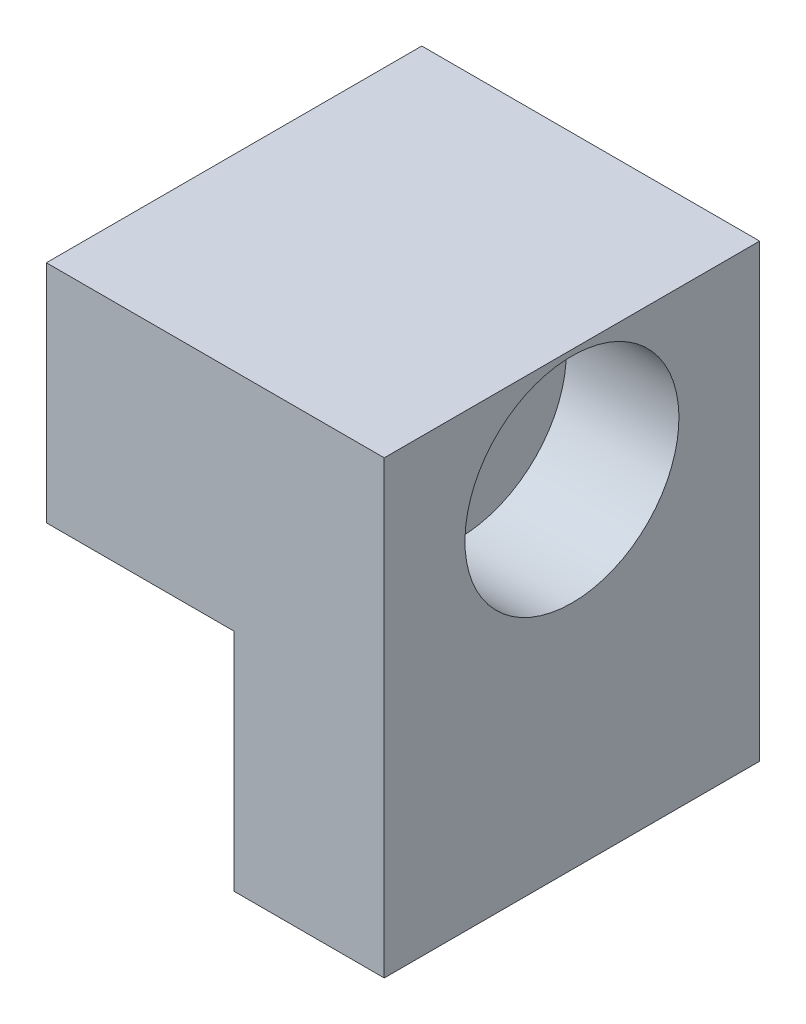
ISO-10303-21;
HEADER;
FILE_DESCRIPTION(('STEP AP214'),'2;1');
FILE_NAME('part.step','',(''),(''),'','','');
FILE_SCHEMA(('AUTOMOTIVE_DESIGN { 1 0 10303 214 1 1 1 1 }'));
ENDSEC;
DATA;
#1=APPLICATION_CONTEXT('core data for automotive mechanical design processes');
#2=APPLICATION_PROTOCOL_DEFINITION('international standard','automotive_design',2000,#1);
#3=PRODUCT_CONTEXT('',#1,'mechanical');
#4=PRODUCT('Part','Part','',(#3));
#5=PRODUCT_RELATED_PRODUCT_CATEGORY('part','',(#4));
#6=PRODUCT_DEFINITION_FORMATION('','',#4);
#7=PRODUCT_DEFINITION_CONTEXT('part definition',#1,'design');
#8=PRODUCT_DEFINITION('design','',#6,#7);
#9=PRODUCT_DEFINITION_SHAPE('','',#8);
#10=(LENGTH_UNIT() NAMED_UNIT(*) SI_UNIT(.MILLI.,.METRE.));
#11=(NAMED_UNIT(*) PLANE_ANGLE_UNIT() SI_UNIT($,.RADIAN.));
#12=(NAMED_UNIT(*) SI_UNIT($,.STERADIAN.) SOLID_ANGLE_UNIT());
#13=UNCERTAINTY_MEASURE_WITH_UNIT(LENGTH_MEASURE(1.E-05),#10,'distance_accuracy_value','');
#14=(GEOMETRIC_REPRESENTATION_CONTEXT(3) GLOBAL_UNCERTAINTY_ASSIGNED_CONTEXT((#13)) GLOBAL_UNIT_ASSIGNED_CONTEXT((#10,
#11,#12)) REPRESENTATION_CONTEXT('',''));
#15=CARTESIAN_POINT('',(0.,0.,0.));
#16=DIRECTION('',(0.,0.,1.));
#17=DIRECTION('',(1.,0.,0.));
#18=AXIS2_PLACEMENT_3D('',#15,#16,#17);
#19=CARTESIAN_POINT('',(0.,-6.,10.));
#20=DIRECTION('',(1.,0.,0.));
#21=DIRECTION('',(0.,0.,-1.));
#22=AXIS2_PLACEMENT_3D('',#19,#20,#21);
#23=PLANE('',#22);
#24=CARTESIAN_POINT('',(0.,-3.,5.));
#25=DIRECTION('',(-1.,0.,0.));
#26=DIRECTION('',(0.,-1.,0.));
#27=AXIS2_PLACEMENT_3D('',#24,#25,#26);
#28=CIRCLE('',#27,1.275);
#29=CARTESIAN_POINT('',(0.,-4.275,5.));
#30=VERTEX_POINT('',#29);
#31=EDGE_CURVE('E181',#30,#30,#28,.T.);
#32=ORIENTED_EDGE('',*,*,#31,.F.);
#33=EDGE_LOOP('',(#32));
#34=FACE_BOUND('',#33,.T.);
#35=DIRECTION('',(0.,-1.,0.));
#36=VECTOR('',#35,1.);
#37=CARTESIAN_POINT('',(0.,-6.,0.));
#38=LINE('',#37,#36);
#39=CARTESIAN_POINT('',(0.,0.,0.));
#40=VERTEX_POINT('',#39);
#41=CARTESIAN_POINT('',(0.,-6.,0.));
#42=VERTEX_POINT('',#41);
#43=EDGE_CURVE('E128',#40,#42,#38,.T.);
#44=ORIENTED_EDGE('',*,*,#43,.T.);
#45=DIRECTION('',(0.,0.,-1.));
#46=VECTOR('',#45,1.);
#47=CARTESIAN_POINT('',(0.,-6.,10.));
#48=LINE('',#47,#46);
#49=CARTESIAN_POINT('',(0.,-6.,10.));
#50=VERTEX_POINT('',#49);
#51=EDGE_CURVE('E11',#50,#42,#48,.T.);
#52=ORIENTED_EDGE('',*,*,#51,.F.);
#53=DIRECTION('',(0.,-1.,0.));
#54=VECTOR('',#53,1.);
#55=CARTESIAN_POINT('',(0.,-6.,10.));
#56=LINE('',#55,#54);
#57=CARTESIAN_POINT('',(0.,0.,10.));
#58=VERTEX_POINT('',#57);
#59=EDGE_CURVE('E145',#58,#50,#56,.T.);
#60=ORIENTED_EDGE('',*,*,#59,.F.);
#61=DIRECTION('',(0.,0.,-1.));
#62=VECTOR('',#61,1.);
#63=CARTESIAN_POINT('',(0.,0.,10.));
#64=LINE('',#63,#62);
#65=EDGE_CURVE('E124',#58,#40,#64,.T.);
#66=ORIENTED_EDGE('',*,*,#65,.T.);
#67=EDGE_LOOP('',(#44,#52,#60,#66));
#68=FACE_BOUND('',#67,.T.);
#69=ADVANCED_FACE('F39',(#34,#68),#23,.F.);
#70=CARTESIAN_POINT('',(5.,-6.,10.));
#71=DIRECTION('',(0.,1.,0.));
#72=DIRECTION('',(-1.,0.,0.));
#73=AXIS2_PLACEMENT_3D('',#70,#71,#72);
#74=PLANE('',#73);
#75=DIRECTION('',(1.,0.,0.));
#76=VECTOR('',#75,1.);
#77=CARTESIAN_POINT('',(5.,-6.,0.));
#78=LINE('',#77,#76);
#79=CARTESIAN_POINT('',(5.,-6.,0.));
#80=VERTEX_POINT('',#79);
#81=EDGE_CURVE('E132',#42,#80,#78,.T.);
#82=ORIENTED_EDGE('',*,*,#81,.T.);
#83=DIRECTION('',(0.,0.,-1.));
#84=VECTOR('',#83,1.);
#85=CARTESIAN_POINT('',(5.,-6.,10.));
#86=LINE('',#85,#84);
#87=CARTESIAN_POINT('',(5.,-6.,10.));
#88=VERTEX_POINT('',#87);
#89=EDGE_CURVE('E48',#88,#80,#86,.T.);
#90=ORIENTED_EDGE('',*,*,#89,.F.);
#91=DIRECTION('',(1.,0.,0.));
#92=VECTOR('',#91,1.);
#93=CARTESIAN_POINT('',(5.,-6.,10.));
#94=LINE('',#93,#92);
#95=EDGE_CURVE('E93',#50,#88,#94,.T.);
#96=ORIENTED_EDGE('',*,*,#95,.F.);
#97=ORIENTED_EDGE('',*,*,#51,.T.);
#98=EDGE_LOOP('',(#82,#90,#96,#97));
#99=FACE_BOUND('',#98,.T.);
#100=ADVANCED_FACE('F174',(#99),#74,.F.);
#101=CARTESIAN_POINT('',(5.,-12.,10.));
#102=DIRECTION('',(1.,0.,0.));
#103=DIRECTION('',(0.,1.,0.));
#104=AXIS2_PLACEMENT_3D('',#101,#102,#103);
#105=PLANE('',#104);
#106=DIRECTION('',(0.,-1.,0.));
#107=VECTOR('',#106,1.);
#108=CARTESIAN_POINT('',(5.,-12.,0.));
#109=LINE('',#108,#107);
#110=CARTESIAN_POINT('',(5.,-12.,0.));
#111=VERTEX_POINT('',#110);
#112=EDGE_CURVE('E136',#80,#111,#109,.T.);
#113=ORIENTED_EDGE('',*,*,#112,.T.);
#114=DIRECTION('',(0.,0.,-1.));
#115=VECTOR('',#114,1.);
#116=CARTESIAN_POINT('',(5.,-12.,10.));
#117=LINE('',#116,#115);
#118=CARTESIAN_POINT('',(5.,-12.,10.));
#119=VERTEX_POINT('',#118);
#120=EDGE_CURVE('E117',#119,#111,#117,.T.);
#121=ORIENTED_EDGE('',*,*,#120,.F.);
#122=DIRECTION('',(0.,-1.,0.));
#123=VECTOR('',#122,1.);
#124=CARTESIAN_POINT('',(5.,-12.,10.));
#125=LINE('',#124,#123);
#126=EDGE_CURVE('E106',#88,#119,#125,.T.);
#127=ORIENTED_EDGE('',*,*,#126,.F.);
#128=ORIENTED_EDGE('',*,*,#89,.T.);
#129=EDGE_LOOP('',(#113,#121,#127,#128));
#130=FACE_BOUND('',#129,.T.);
#131=ADVANCED_FACE('F155',(#130),#105,.F.);
#132=CARTESIAN_POINT('',(9.,-12.,10.));
#133=DIRECTION('',(0.,1.,0.));
#134=DIRECTION('',(0.,0.,1.));
#135=AXIS2_PLACEMENT_3D('',#132,#133,#134);
#136=PLANE('',#135);
#137=DIRECTION('',(1.,0.,0.));
#138=VECTOR('',#137,1.);
#139=CARTESIAN_POINT('',(9.,-12.,0.));
#140=LINE('',#139,#138);
#141=CARTESIAN_POINT('',(9.,-12.,0.));
#142=VERTEX_POINT('',#141);
#143=EDGE_CURVE('E115',#111,#142,#140,.T.);
#144=ORIENTED_EDGE('',*,*,#143,.T.);
#145=DIRECTION('',(0.,0.,-1.));
#146=VECTOR('',#145,1.);
#147=CARTESIAN_POINT('',(9.,-12.,10.));
#148=LINE('',#147,#146);
#149=CARTESIAN_POINT('',(9.,-12.,10.));
#150=VERTEX_POINT('',#149);
#151=EDGE_CURVE('E112',#150,#142,#148,.T.);
#152=ORIENTED_EDGE('',*,*,#151,.F.);
#153=DIRECTION('',(1.,0.,0.));
#154=VECTOR('',#153,1.);
#155=CARTESIAN_POINT('',(9.,-12.,10.));
#156=LINE('',#155,#154);
#157=EDGE_CURVE('E100',#119,#150,#156,.T.);
#158=ORIENTED_EDGE('',*,*,#157,.F.);
#159=ORIENTED_EDGE('',*,*,#120,.T.);
#160=EDGE_LOOP('',(#144,#152,#158,#159));
#161=FACE_BOUND('',#160,.T.);
#162=ADVANCED_FACE('F113',(#161),#136,.F.);
#163=CARTESIAN_POINT('',(9.,0.,10.));
#164=DIRECTION('',(-1.,0.,0.));
#165=DIRECTION('',(0.,0.,1.));
#166=AXIS2_PLACEMENT_3D('',#163,#164,#165);
#167=PLANE('',#166);
#168=CARTESIAN_POINT('',(9.,-3.,5.));
#169=DIRECTION('',(-1.,0.,0.));
#170=DIRECTION('',(0.,-1.,0.));
#171=AXIS2_PLACEMENT_3D('',#168,#169,#170);
#172=CIRCLE('',#171,2.85);
#173=CARTESIAN_POINT('',(9.,-5.85,5.));
#174=VERTEX_POINT('',#173);
#175=EDGE_CURVE('E133',#174,#174,#172,.T.);
#176=ORIENTED_EDGE('',*,*,#175,.T.);
#177=EDGE_LOOP('',(#176));
#178=FACE_BOUND('',#177,.T.);
#179=DIRECTION('',(0.,1.,0.));
#180=VECTOR('',#179,1.);
#181=CARTESIAN_POINT('',(9.,0.,0.));
#182=LINE('',#181,#180);
#183=CARTESIAN_POINT('',(9.,0.,0.));
#184=VERTEX_POINT('',#183);
#185=EDGE_CURVE('E79',#142,#184,#182,.T.);
#186=ORIENTED_EDGE('',*,*,#185,.T.);
#187=DIRECTION('',(0.,0.,-1.));
#188=VECTOR('',#187,1.);
#189=CARTESIAN_POINT('',(9.,0.,10.));
#190=LINE('',#189,#188);
#191=CARTESIAN_POINT('',(9.,0.,10.));
#192=VERTEX_POINT('',#191);
#193=EDGE_CURVE('E118',#192,#184,#190,.T.);
#194=ORIENTED_EDGE('',*,*,#193,.F.);
#195=DIRECTION('',(0.,1.,0.));
#196=VECTOR('',#195,1.);
#197=CARTESIAN_POINT('',(9.,0.,10.));
#198=LINE('',#197,#196);
#199=EDGE_CURVE('E104',#150,#192,#198,.T.);
#200=ORIENTED_EDGE('',*,*,#199,.F.);
#201=ORIENTED_EDGE('',*,*,#151,.T.);
#202=EDGE_LOOP('',(#186,#194,#200,#201));
#203=FACE_BOUND('',#202,.T.);
#204=ADVANCED_FACE('F120',(#178,#203),#167,.F.);
#205=CARTESIAN_POINT('',(0.,0.,10.));
#206=DIRECTION('',(0.,-1.,0.));
#207=DIRECTION('',(0.,0.,-1.));
#208=AXIS2_PLACEMENT_3D('',#205,#206,#207);
#209=PLANE('',#208);
#210=DIRECTION('',(-1.,0.,0.));
#211=VECTOR('',#210,1.);
#212=CARTESIAN_POINT('',(0.,0.,0.));
#213=LINE('',#212,#211);
#214=EDGE_CURVE('E85',#184,#40,#213,.T.);
#215=ORIENTED_EDGE('',*,*,#214,.T.);
#216=ORIENTED_EDGE('',*,*,#65,.F.);
#217=DIRECTION('',(-1.,0.,0.));
#218=VECTOR('',#217,1.);
#219=CARTESIAN_POINT('',(0.,0.,10.));
#220=LINE('',#219,#218);
#221=EDGE_CURVE('E56',#192,#58,#220,.T.);
#222=ORIENTED_EDGE('',*,*,#221,.F.);
#223=ORIENTED_EDGE('',*,*,#193,.T.);
#224=EDGE_LOOP('',(#215,#216,#222,#223));
#225=FACE_BOUND('',#224,.T.);
#226=ADVANCED_FACE('F162',(#225),#209,.F.);
#227=CARTESIAN_POINT('',(0.,0.,10.));
#228=DIRECTION('',(0.,0.,-1.));
#229=DIRECTION('',(-1.,0.,0.));
#230=AXIS2_PLACEMENT_3D('',#227,#228,#229);
#231=PLANE('',#230);
#232=ORIENTED_EDGE('',*,*,#59,.T.);
#233=ORIENTED_EDGE('',*,*,#95,.T.);
#234=ORIENTED_EDGE('',*,*,#126,.T.);
#235=ORIENTED_EDGE('',*,*,#157,.T.);
#236=ORIENTED_EDGE('',*,*,#199,.T.);
#237=ORIENTED_EDGE('',*,*,#221,.T.);
#238=EDGE_LOOP('',(#232,#233,#234,#235,#236,#237));
#239=FACE_BOUND('',#238,.T.);
#240=ADVANCED_FACE('F102',(#239),#231,.F.);
#241=CARTESIAN_POINT('',(0.,0.,0.));
#242=DIRECTION('',(0.,0.,-1.));
#243=DIRECTION('',(-1.,0.,0.));
#244=AXIS2_PLACEMENT_3D('',#241,#242,#243);
#245=PLANE('',#244);
#246=ORIENTED_EDGE('',*,*,#43,.F.);
#247=ORIENTED_EDGE('',*,*,#214,.F.);
#248=ORIENTED_EDGE('',*,*,#185,.F.);
#249=ORIENTED_EDGE('',*,*,#143,.F.);
#250=ORIENTED_EDGE('',*,*,#112,.F.);
#251=ORIENTED_EDGE('',*,*,#81,.F.);
#252=EDGE_LOOP('',(#246,#247,#248,#249,#250,#251));
#253=FACE_BOUND('',#252,.T.);
#254=ADVANCED_FACE('F158',(#253),#245,.T.);
#255=CARTESIAN_POINT('',(0.,-3.,5.));
#256=DIRECTION('',(-1.,0.,0.));
#257=DIRECTION('',(0.,-1.,0.));
#258=AXIS2_PLACEMENT_3D('',#255,#256,#257);
#259=CYLINDRICAL_SURFACE('',#258,2.85);
#260=CARTESIAN_POINT('',(6.,-3.,5.));
#261=DIRECTION('',(-1.,0.,0.));
#262=DIRECTION('',(0.,-1.,0.));
#263=AXIS2_PLACEMENT_3D('',#260,#261,#262);
#264=CIRCLE('',#263,2.85);
#265=CARTESIAN_POINT('',(6.,-5.85,5.));
#266=VERTEX_POINT('',#265);
#267=EDGE_CURVE('E188',#266,#266,#264,.T.);
#268=ORIENTED_EDGE('',*,*,#267,.T.);
#269=EDGE_LOOP('',(#268));
#270=FACE_BOUND('',#269,.T.);
#271=ORIENTED_EDGE('',*,*,#175,.F.);
#272=EDGE_LOOP('',(#271));
#273=FACE_BOUND('',#272,.T.);
#274=ADVANCED_FACE('F203',(#270,#273),#259,.F.);
#275=CARTESIAN_POINT('',(6.,-3.,3.725));
#276=DIRECTION('',(1.,0.,0.));
#277=DIRECTION('',(0.,1.,0.));
#278=AXIS2_PLACEMENT_3D('',#275,#276,#277);
#279=PLANE('',#278);
#280=CARTESIAN_POINT('',(6.,-3.,5.));
#281=DIRECTION('',(-1.,0.,0.));
#282=DIRECTION('',(0.,-1.,0.));
#283=AXIS2_PLACEMENT_3D('',#280,#281,#282);
#284=CIRCLE('',#283,1.275);
#285=CARTESIAN_POINT('',(6.,-4.275,5.));
#286=VERTEX_POINT('',#285);
#287=EDGE_CURVE('E184',#286,#286,#284,.T.);
#288=ORIENTED_EDGE('',*,*,#287,.T.);
#289=EDGE_LOOP('',(#288));
#290=FACE_BOUND('',#289,.T.);
#291=ORIENTED_EDGE('',*,*,#267,.F.);
#292=EDGE_LOOP('',(#291));
#293=FACE_BOUND('',#292,.T.);
#294=ADVANCED_FACE('F205',(#290,#293),#279,.T.);
#295=CARTESIAN_POINT('',(0.,-3.,5.));
#296=DIRECTION('',(-1.,0.,0.));
#297=DIRECTION('',(0.,-1.,0.));
#298=AXIS2_PLACEMENT_3D('',#295,#296,#297);
#299=CYLINDRICAL_SURFACE('',#298,1.275);
#300=ORIENTED_EDGE('',*,*,#31,.T.);
#301=EDGE_LOOP('',(#300));
#302=FACE_BOUND('',#301,.T.);
#303=ORIENTED_EDGE('',*,*,#287,.F.);
#304=EDGE_LOOP('',(#303));
#305=FACE_BOUND('',#304,.T.);
#306=ADVANCED_FACE('F212',(#302,#305),#299,.F.);
#307=CLOSED_SHELL('',(#69,#100,#131,#162,#204,#226,#240,#254,#274,#294,#306));
#308=MANIFOLD_SOLID_BREP('B2',#307);
#309=ADVANCED_BREP_SHAPE_REPRESENTATION('',(#18,#308),#14);
#310=SHAPE_DEFINITION_REPRESENTATION(#9,#309);
ENDSEC;
END-ISO-10303-21;
